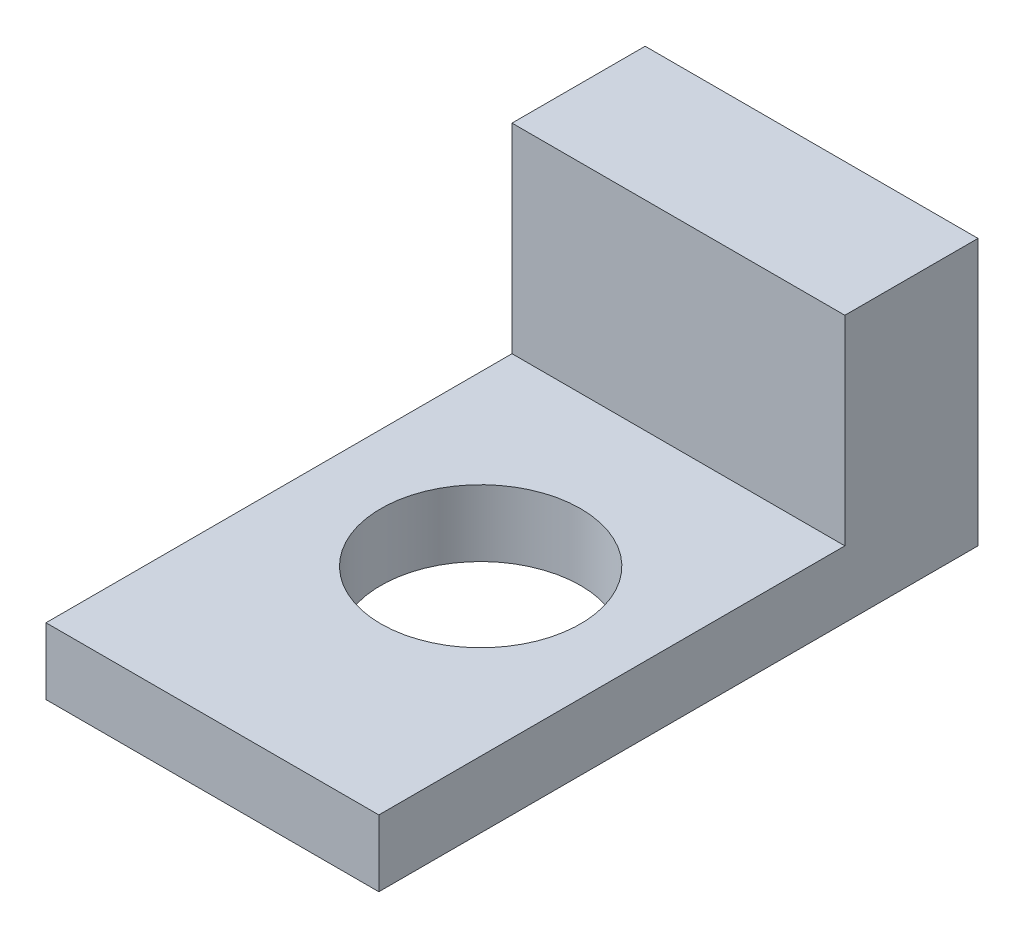
ISO-10303-21;
HEADER;
FILE_DESCRIPTION(('STEP AP214'),'2;1');
FILE_NAME('part.step','',(''),(''),'','','');
FILE_SCHEMA(('AUTOMOTIVE_DESIGN { 1 0 10303 214 1 1 1 1 }'));
ENDSEC;
DATA;
#1=APPLICATION_CONTEXT('core data for automotive mechanical design processes');
#2=APPLICATION_PROTOCOL_DEFINITION('international standard','automotive_design',2000,#1);
#3=PRODUCT_CONTEXT('',#1,'mechanical');
#4=PRODUCT('Part','Part','',(#3));
#5=PRODUCT_RELATED_PRODUCT_CATEGORY('part','',(#4));
#6=PRODUCT_DEFINITION_FORMATION('','',#4);
#7=PRODUCT_DEFINITION_CONTEXT('part definition',#1,'design');
#8=PRODUCT_DEFINITION('design','',#6,#7);
#9=PRODUCT_DEFINITION_SHAPE('','',#8);
#10=(LENGTH_UNIT() NAMED_UNIT(*) SI_UNIT(.MILLI.,.METRE.));
#11=(NAMED_UNIT(*) PLANE_ANGLE_UNIT() SI_UNIT($,.RADIAN.));
#12=(NAMED_UNIT(*) SI_UNIT($,.STERADIAN.) SOLID_ANGLE_UNIT());
#13=UNCERTAINTY_MEASURE_WITH_UNIT(LENGTH_MEASURE(1.E-05),#10,'distance_accuracy_value','');
#14=(GEOMETRIC_REPRESENTATION_CONTEXT(3) GLOBAL_UNCERTAINTY_ASSIGNED_CONTEXT((#13)) GLOBAL_UNIT_ASSIGNED_CONTEXT((#10,
#11,#12)) REPRESENTATION_CONTEXT('',''));
#15=CARTESIAN_POINT('',(0.,0.,0.));
#16=DIRECTION('',(0.,0.,1.));
#17=DIRECTION('',(1.,0.,0.));
#18=AXIS2_PLACEMENT_3D('',#15,#16,#17);
#19=CARTESIAN_POINT('',(0.,0.,90.));
#20=DIRECTION('',(0.,-1.,0.));
#21=DIRECTION('',(0.,0.,-1.));
#22=AXIS2_PLACEMENT_3D('',#19,#20,#21);
#23=PLANE('',#22);
#24=CARTESIAN_POINT('',(25.2949289938495,0.,50.));
#25=DIRECTION('',(0.,1.,0.));
#26=DIRECTION('',(0.,0.,1.));
#27=AXIS2_PLACEMENT_3D('',#24,#25,#26);
#28=CIRCLE('',#27,15.0006);
#29=CARTESIAN_POINT('',(25.2949289938495,0.,65.0006));
#30=VERTEX_POINT('',#29);
#31=EDGE_CURVE('E142',#30,#30,#28,.T.);
#32=ORIENTED_EDGE('',*,*,#31,.F.);
#33=EDGE_LOOP('',(#32));
#34=FACE_BOUND('',#33,.T.);
#35=DIRECTION('',(1.,0.,0.));
#36=VECTOR('',#35,1.);
#37=CARTESIAN_POINT('',(0.,0.,20.));
#38=LINE('',#37,#36);
#39=CARTESIAN_POINT('',(0.,0.,20.));
#40=VERTEX_POINT('',#39);
#41=CARTESIAN_POINT('',(50.,0.,20.));
#42=VERTEX_POINT('',#41);
#43=EDGE_CURVE('E47',#40,#42,#38,.T.);
#44=ORIENTED_EDGE('',*,*,#43,.F.);
#45=DIRECTION('',(0.,0.,-1.));
#46=VECTOR('',#45,1.);
#47=CARTESIAN_POINT('',(0.,0.,90.));
#48=LINE('',#47,#46);
#49=CARTESIAN_POINT('',(0.,0.,90.));
#50=VERTEX_POINT('',#49);
#51=EDGE_CURVE('E113',#50,#40,#48,.T.);
#52=ORIENTED_EDGE('',*,*,#51,.F.);
#53=DIRECTION('',(-1.,0.,0.));
#54=VECTOR('',#53,1.);
#55=CARTESIAN_POINT('',(0.,0.,90.));
#56=LINE('',#55,#54);
#57=CARTESIAN_POINT('',(50.,0.,90.));
#58=VERTEX_POINT('',#57);
#59=EDGE_CURVE('E56',#58,#50,#56,.T.);
#60=ORIENTED_EDGE('',*,*,#59,.F.);
#61=DIRECTION('',(0.,0.,-1.));
#62=VECTOR('',#61,1.);
#63=CARTESIAN_POINT('',(50.,0.,90.));
#64=LINE('',#63,#62);
#65=EDGE_CURVE('E130',#58,#42,#64,.T.);
#66=ORIENTED_EDGE('',*,*,#65,.T.);
#67=EDGE_LOOP('',(#44,#52,#60,#66));
#68=FACE_BOUND('',#67,.T.);
#69=ADVANCED_FACE('F32',(#34,#68),#23,.F.);
#70=CARTESIAN_POINT('',(0.,0.,90.));
#71=DIRECTION('',(1.,0.,0.));
#72=DIRECTION('',(0.,1.,0.));
#73=AXIS2_PLACEMENT_3D('',#70,#71,#72);
#74=PLANE('',#73);
#75=DIRECTION('',(0.,-1.,0.));
#76=VECTOR('',#75,1.);
#77=CARTESIAN_POINT('',(0.,0.,0.));
#78=LINE('',#77,#76);
#79=CARTESIAN_POINT('',(0.,30.,0.));
#80=VERTEX_POINT('',#79);
#81=CARTESIAN_POINT('',(0.,-10.,0.));
#82=VERTEX_POINT('',#81);
#83=EDGE_CURVE('E114',#80,#82,#78,.T.);
#84=ORIENTED_EDGE('',*,*,#83,.T.);
#85=DIRECTION('',(0.,0.,-1.));
#86=VECTOR('',#85,1.);
#87=CARTESIAN_POINT('',(0.,-10.,90.));
#88=LINE('',#87,#86);
#89=CARTESIAN_POINT('',(0.,-10.,90.));
#90=VERTEX_POINT('',#89);
#91=EDGE_CURVE('E11',#90,#82,#88,.T.);
#92=ORIENTED_EDGE('',*,*,#91,.F.);
#93=DIRECTION('',(0.,-1.,0.));
#94=VECTOR('',#93,1.);
#95=CARTESIAN_POINT('',(0.,0.,90.));
#96=LINE('',#95,#94);
#97=EDGE_CURVE('E120',#50,#90,#96,.T.);
#98=ORIENTED_EDGE('',*,*,#97,.F.);
#99=ORIENTED_EDGE('',*,*,#51,.T.);
#100=DIRECTION('',(0.,-1.,0.));
#101=VECTOR('',#100,1.);
#102=CARTESIAN_POINT('',(0.,30.,20.));
#103=LINE('',#102,#101);
#104=CARTESIAN_POINT('',(0.,30.,20.));
#105=VERTEX_POINT('',#104);
#106=EDGE_CURVE('E95',#105,#40,#103,.T.);
#107=ORIENTED_EDGE('',*,*,#106,.F.);
#108=DIRECTION('',(0.,0.,1.));
#109=VECTOR('',#108,1.);
#110=CARTESIAN_POINT('',(0.,30.,0.));
#111=LINE('',#110,#109);
#112=EDGE_CURVE('E102',#80,#105,#111,.T.);
#113=ORIENTED_EDGE('',*,*,#112,.F.);
#114=EDGE_LOOP('',(#84,#92,#98,#99,#107,#113));
#115=FACE_BOUND('',#114,.T.);
#116=ADVANCED_FACE('F34',(#115),#74,.F.);
#117=CARTESIAN_POINT('',(0.,-10.,90.));
#118=DIRECTION('',(0.,1.,0.));
#119=DIRECTION('',(0.,0.,1.));
#120=AXIS2_PLACEMENT_3D('',#117,#118,#119);
#121=PLANE('',#120);
#122=CARTESIAN_POINT('',(25.2949289938495,-10.,50.));
#123=DIRECTION('',(0.,1.,0.));
#124=DIRECTION('',(0.,0.,1.));
#125=AXIS2_PLACEMENT_3D('',#122,#123,#124);
#126=CIRCLE('',#125,15.0006);
#127=CARTESIAN_POINT('',(25.2949289938495,-10.,65.0006));
#128=VERTEX_POINT('',#127);
#129=EDGE_CURVE('E140',#128,#128,#126,.T.);
#130=ORIENTED_EDGE('',*,*,#129,.T.);
#131=EDGE_LOOP('',(#130));
#132=FACE_BOUND('',#131,.T.);
#133=DIRECTION('',(1.,0.,0.));
#134=VECTOR('',#133,1.);
#135=CARTESIAN_POINT('',(0.,-10.,0.));
#136=LINE('',#135,#134);
#137=CARTESIAN_POINT('',(50.,-10.,0.));
#138=VERTEX_POINT('',#137);
#139=EDGE_CURVE('E69',#82,#138,#136,.T.);
#140=ORIENTED_EDGE('',*,*,#139,.T.);
#141=DIRECTION('',(0.,0.,-1.));
#142=VECTOR('',#141,1.);
#143=CARTESIAN_POINT('',(50.,-10.,90.));
#144=LINE('',#143,#142);
#145=CARTESIAN_POINT('',(50.,-10.,90.));
#146=VERTEX_POINT('',#145);
#147=EDGE_CURVE('E40',#146,#138,#144,.T.);
#148=ORIENTED_EDGE('',*,*,#147,.F.);
#149=DIRECTION('',(1.,0.,0.));
#150=VECTOR('',#149,1.);
#151=CARTESIAN_POINT('',(0.,-10.,90.));
#152=LINE('',#151,#150);
#153=EDGE_CURVE('E74',#90,#146,#152,.T.);
#154=ORIENTED_EDGE('',*,*,#153,.F.);
#155=ORIENTED_EDGE('',*,*,#91,.T.);
#156=EDGE_LOOP('',(#140,#148,#154,#155));
#157=FACE_BOUND('',#156,.T.);
#158=ADVANCED_FACE('F157',(#132,#157),#121,.F.);
#159=CARTESIAN_POINT('',(50.,0.,90.));
#160=DIRECTION('',(-1.,0.,0.));
#161=DIRECTION('',(0.,0.,1.));
#162=AXIS2_PLACEMENT_3D('',#159,#160,#161);
#163=PLANE('',#162);
#164=DIRECTION('',(0.,1.,0.));
#165=VECTOR('',#164,1.);
#166=CARTESIAN_POINT('',(50.,0.,0.));
#167=LINE('',#166,#165);
#168=CARTESIAN_POINT('',(50.,30.,0.));
#169=VERTEX_POINT('',#168);
#170=EDGE_CURVE('E122',#138,#169,#167,.T.);
#171=ORIENTED_EDGE('',*,*,#170,.T.);
#172=DIRECTION('',(0.,0.,-1.));
#173=VECTOR('',#172,1.);
#174=CARTESIAN_POINT('',(50.,30.,0.));
#175=LINE('',#174,#173);
#176=CARTESIAN_POINT('',(50.,30.,20.));
#177=VERTEX_POINT('',#176);
#178=EDGE_CURVE('E101',#177,#169,#175,.T.);
#179=ORIENTED_EDGE('',*,*,#178,.F.);
#180=DIRECTION('',(0.,-1.,0.));
#181=VECTOR('',#180,1.);
#182=CARTESIAN_POINT('',(50.,30.,20.));
#183=LINE('',#182,#181);
#184=EDGE_CURVE('E97',#177,#42,#183,.T.);
#185=ORIENTED_EDGE('',*,*,#184,.T.);
#186=ORIENTED_EDGE('',*,*,#65,.F.);
#187=DIRECTION('',(0.,1.,0.));
#188=VECTOR('',#187,1.);
#189=CARTESIAN_POINT('',(50.,0.,90.));
#190=LINE('',#189,#188);
#191=EDGE_CURVE('E124',#146,#58,#190,.T.);
#192=ORIENTED_EDGE('',*,*,#191,.F.);
#193=ORIENTED_EDGE('',*,*,#147,.T.);
#194=EDGE_LOOP('',(#171,#179,#185,#186,#192,#193));
#195=FACE_BOUND('',#194,.T.);
#196=ADVANCED_FACE('F134',(#195),#163,.F.);
#197=CARTESIAN_POINT('',(0.,0.,90.));
#198=DIRECTION('',(0.,0.,1.));
#199=DIRECTION('',(1.,0.,0.));
#200=AXIS2_PLACEMENT_3D('',#197,#198,#199);
#201=PLANE('',#200);
#202=ORIENTED_EDGE('',*,*,#97,.T.);
#203=ORIENTED_EDGE('',*,*,#153,.T.);
#204=ORIENTED_EDGE('',*,*,#191,.T.);
#205=ORIENTED_EDGE('',*,*,#59,.T.);
#206=EDGE_LOOP('',(#202,#203,#204,#205));
#207=FACE_BOUND('',#206,.T.);
#208=ADVANCED_FACE('F162',(#207),#201,.T.);
#209=CARTESIAN_POINT('',(0.,0.,0.));
#210=DIRECTION('',(0.,0.,1.));
#211=DIRECTION('',(1.,0.,0.));
#212=AXIS2_PLACEMENT_3D('',#209,#210,#211);
#213=PLANE('',#212);
#214=ORIENTED_EDGE('',*,*,#83,.F.);
#215=DIRECTION('',(-1.,0.,0.));
#216=VECTOR('',#215,1.);
#217=CARTESIAN_POINT('',(0.,30.,0.));
#218=LINE('',#217,#216);
#219=EDGE_CURVE('E108',#169,#80,#218,.T.);
#220=ORIENTED_EDGE('',*,*,#219,.F.);
#221=ORIENTED_EDGE('',*,*,#170,.F.);
#222=ORIENTED_EDGE('',*,*,#139,.F.);
#223=EDGE_LOOP('',(#214,#220,#221,#222));
#224=FACE_BOUND('',#223,.T.);
#225=ADVANCED_FACE('F137',(#224),#213,.F.);
#226=CARTESIAN_POINT('',(0.,30.,20.));
#227=DIRECTION('',(0.,0.,-1.));
#228=DIRECTION('',(-1.,0.,0.));
#229=AXIS2_PLACEMENT_3D('',#226,#227,#228);
#230=PLANE('',#229);
#231=ORIENTED_EDGE('',*,*,#43,.T.);
#232=ORIENTED_EDGE('',*,*,#184,.F.);
#233=DIRECTION('',(1.,0.,0.));
#234=VECTOR('',#233,1.);
#235=CARTESIAN_POINT('',(0.,30.,20.));
#236=LINE('',#235,#234);
#237=EDGE_CURVE('E91',#105,#177,#236,.T.);
#238=ORIENTED_EDGE('',*,*,#237,.F.);
#239=ORIENTED_EDGE('',*,*,#106,.T.);
#240=EDGE_LOOP('',(#231,#232,#238,#239));
#241=FACE_BOUND('',#240,.T.);
#242=ADVANCED_FACE('F93',(#241),#230,.F.);
#243=CARTESIAN_POINT('',(0.,30.,0.));
#244=DIRECTION('',(0.,1.,0.));
#245=DIRECTION('',(0.,0.,1.));
#246=AXIS2_PLACEMENT_3D('',#243,#244,#245);
#247=PLANE('',#246);
#248=ORIENTED_EDGE('',*,*,#112,.T.);
#249=ORIENTED_EDGE('',*,*,#237,.T.);
#250=ORIENTED_EDGE('',*,*,#178,.T.);
#251=ORIENTED_EDGE('',*,*,#219,.T.);
#252=EDGE_LOOP('',(#248,#249,#250,#251));
#253=FACE_BOUND('',#252,.T.);
#254=ADVANCED_FACE('F106',(#253),#247,.T.);
#255=CARTESIAN_POINT('',(25.2949289938495,-10.,50.));
#256=DIRECTION('',(0.,1.,0.));
#257=DIRECTION('',(0.,0.,1.));
#258=AXIS2_PLACEMENT_3D('',#255,#256,#257);
#259=CYLINDRICAL_SURFACE('',#258,15.0006);
#260=ORIENTED_EDGE('',*,*,#129,.F.);
#261=EDGE_LOOP('',(#260));
#262=FACE_BOUND('',#261,.T.);
#263=ORIENTED_EDGE('',*,*,#31,.T.);
#264=EDGE_LOOP('',(#263));
#265=FACE_BOUND('',#264,.T.);
#266=ADVANCED_FACE('F150',(#262,#265),#259,.F.);
#267=CLOSED_SHELL('',(#69,#116,#158,#196,#208,#225,#242,#254,#266));
#268=MANIFOLD_SOLID_BREP('B2',#267);
#269=ADVANCED_BREP_SHAPE_REPRESENTATION('',(#18,#268),#14);
#270=SHAPE_DEFINITION_REPRESENTATION(#9,#269);
ENDSEC;
END-ISO-10303-21;
